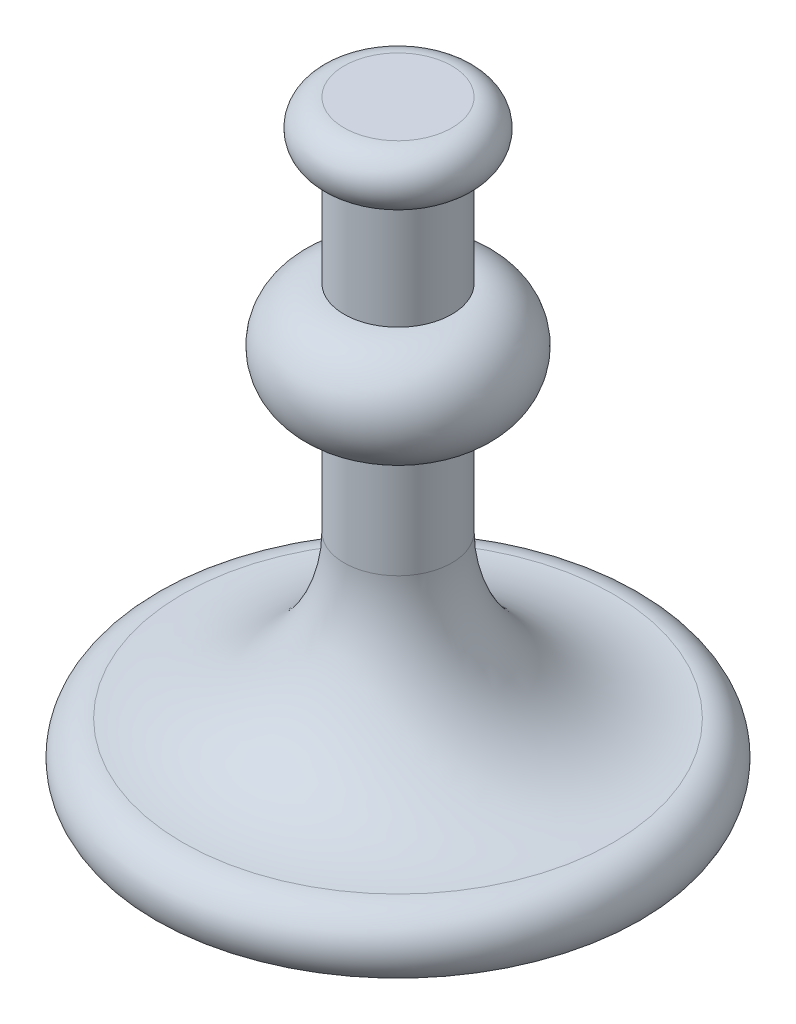
ISO-10303-21;
HEADER;
FILE_DESCRIPTION(('STEP AP214'),'2;1');
FILE_NAME('part.step','',(''),(''),'','','');
FILE_SCHEMA(('AUTOMOTIVE_DESIGN { 1 0 10303 214 1 1 1 1 }'));
ENDSEC;
DATA;
#1=APPLICATION_CONTEXT('core data for automotive mechanical design processes');
#2=APPLICATION_PROTOCOL_DEFINITION('international standard','automotive_design',2000,#1);
#3=PRODUCT_CONTEXT('',#1,'mechanical');
#4=PRODUCT('Part','Part','',(#3));
#5=PRODUCT_RELATED_PRODUCT_CATEGORY('part','',(#4));
#6=PRODUCT_DEFINITION_FORMATION('','',#4);
#7=PRODUCT_DEFINITION_CONTEXT('part definition',#1,'design');
#8=PRODUCT_DEFINITION('design','',#6,#7);
#9=PRODUCT_DEFINITION_SHAPE('','',#8);
#10=(LENGTH_UNIT() NAMED_UNIT(*) SI_UNIT(.MILLI.,.METRE.));
#11=(NAMED_UNIT(*) PLANE_ANGLE_UNIT() SI_UNIT($,.RADIAN.));
#12=(NAMED_UNIT(*) SI_UNIT($,.STERADIAN.) SOLID_ANGLE_UNIT());
#13=UNCERTAINTY_MEASURE_WITH_UNIT(LENGTH_MEASURE(1.E-05),#10,'distance_accuracy_value','');
#14=(GEOMETRIC_REPRESENTATION_CONTEXT(3) GLOBAL_UNCERTAINTY_ASSIGNED_CONTEXT((#13)) GLOBAL_UNIT_ASSIGNED_CONTEXT((#10,
#11,#12)) REPRESENTATION_CONTEXT('',''));
#15=CARTESIAN_POINT('',(0.,0.,0.));
#16=DIRECTION('',(0.,0.,1.));
#17=DIRECTION('',(1.,0.,0.));
#18=AXIS2_PLACEMENT_3D('',#15,#16,#17);
#19=CARTESIAN_POINT('',(0.,0.,0.));
#20=DIRECTION('',(0.,-1.,0.));
#21=DIRECTION('',(0.,0.,-1.));
#22=AXIS2_PLACEMENT_3D('',#19,#20,#21);
#23=PLANE('',#22);
#24=CARTESIAN_POINT('',(0.,0.,0.));
#25=DIRECTION('',(0.,-1.,0.));
#26=DIRECTION('',(0.,0.,-1.));
#27=AXIS2_PLACEMENT_3D('',#24,#25,#26);
#28=CIRCLE('',#27,90.);
#29=CARTESIAN_POINT('',(0.,0.,-90.));
#30=VERTEX_POINT('',#29);
#31=EDGE_CURVE('E56',#30,#30,#28,.T.);
#32=ORIENTED_EDGE('',*,*,#31,.T.);
#33=EDGE_LOOP('',(#32));
#34=FACE_BOUND('',#33,.T.);
#35=ADVANCED_FACE('F31',(#34),#23,.T.);
#36=CARTESIAN_POINT('',(0.,220.,0.));
#37=DIRECTION('',(0.,1.,0.));
#38=DIRECTION('',(0.,0.,1.));
#39=AXIS2_PLACEMENT_3D('',#36,#37,#38);
#40=PLANE('',#39);
#41=CARTESIAN_POINT('',(0.,220.,0.));
#42=DIRECTION('',(0.,-1.,0.));
#43=DIRECTION('',(0.,0.,-1.));
#44=AXIS2_PLACEMENT_3D('',#41,#42,#43);
#45=CIRCLE('',#44,20.);
#46=CARTESIAN_POINT('',(0.,220.,-20.));
#47=VERTEX_POINT('',#46);
#48=EDGE_CURVE('E10',#47,#47,#45,.T.);
#49=ORIENTED_EDGE('',*,*,#48,.F.);
#50=EDGE_LOOP('',(#49));
#51=FACE_BOUND('',#50,.T.);
#52=ADVANCED_FACE('F73',(#51),#40,.T.);
#53=CARTESIAN_POINT('',(0.,210.,0.));
#54=DIRECTION('',(0.,-1.,0.));
#55=DIRECTION('',(0.,0.,-1.));
#56=AXIS2_PLACEMENT_3D('',#53,#54,#55);
#57=TOROIDAL_SURFACE('',#56,20.,10.);
#58=ORIENTED_EDGE('',*,*,#48,.T.);
#59=EDGE_LOOP('',(#58));
#60=FACE_BOUND('',#59,.T.);
#61=CARTESIAN_POINT('',(0.,200.,0.));
#62=DIRECTION('',(0.,-1.,0.));
#63=DIRECTION('',(0.,0.,-1.));
#64=AXIS2_PLACEMENT_3D('',#61,#62,#63);
#65=CIRCLE('',#64,20.);
#66=CARTESIAN_POINT('',(0.,200.,-20.));
#67=VERTEX_POINT('',#66);
#68=EDGE_CURVE('E37',#67,#67,#65,.T.);
#69=ORIENTED_EDGE('',*,*,#68,.F.);
#70=EDGE_LOOP('',(#69));
#71=FACE_BOUND('',#70,.T.);
#72=ADVANCED_FACE('F77',(#60,#71),#57,.T.);
#73=CARTESIAN_POINT('',(0.,0.,0.));
#74=DIRECTION('',(0.,-1.,0.));
#75=DIRECTION('',(0.,0.,-1.));
#76=AXIS2_PLACEMENT_3D('',#73,#74,#75);
#77=CYLINDRICAL_SURFACE('',#76,20.);
#78=ORIENTED_EDGE('',*,*,#68,.T.);
#79=EDGE_LOOP('',(#78));
#80=FACE_BOUND('',#79,.T.);
#81=CARTESIAN_POINT('',(0.,160.,0.));
#82=DIRECTION('',(0.,-1.,0.));
#83=DIRECTION('',(0.,0.,-1.));
#84=AXIS2_PLACEMENT_3D('',#81,#82,#83);
#85=CIRCLE('',#84,20.);
#86=CARTESIAN_POINT('',(0.,160.,-20.));
#87=VERTEX_POINT('',#86);
#88=EDGE_CURVE('E41',#87,#87,#85,.T.);
#89=ORIENTED_EDGE('',*,*,#88,.F.);
#90=EDGE_LOOP('',(#89));
#91=FACE_BOUND('',#90,.T.);
#92=ADVANCED_FACE('F82',(#80,#91),#77,.T.);
#93=CARTESIAN_POINT('',(0.,140.,0.));
#94=DIRECTION('',(0.,-1.,0.));
#95=DIRECTION('',(0.,0.,-1.));
#96=AXIS2_PLACEMENT_3D('',#93,#94,#95);
#97=DEGENERATE_TOROIDAL_SURFACE('',#96,20.,20.,.T.);
#98=ORIENTED_EDGE('',*,*,#88,.T.);
#99=EDGE_LOOP('',(#98));
#100=FACE_BOUND('',#99,.T.);
#101=CARTESIAN_POINT('',(0.,120.,0.));
#102=DIRECTION('',(0.,-1.,0.));
#103=DIRECTION('',(0.,0.,-1.));
#104=AXIS2_PLACEMENT_3D('',#101,#102,#103);
#105=CIRCLE('',#104,20.);
#106=CARTESIAN_POINT('',(0.,120.,-20.));
#107=VERTEX_POINT('',#106);
#108=EDGE_CURVE('E45',#107,#107,#105,.T.);
#109=ORIENTED_EDGE('',*,*,#108,.F.);
#110=EDGE_LOOP('',(#109));
#111=FACE_BOUND('',#110,.T.);
#112=ADVANCED_FACE('F87',(#100,#111),#97,.T.);
#113=CARTESIAN_POINT('',(0.,0.,0.));
#114=DIRECTION('',(0.,-1.,0.));
#115=DIRECTION('',(0.,0.,-1.));
#116=AXIS2_PLACEMENT_3D('',#113,#114,#115);
#117=CYLINDRICAL_SURFACE('',#116,20.);
#118=ORIENTED_EDGE('',*,*,#108,.T.);
#119=EDGE_LOOP('',(#118));
#120=FACE_BOUND('',#119,.T.);
#121=CARTESIAN_POINT('',(0.,80.,0.));
#122=DIRECTION('',(0.,-1.,0.));
#123=DIRECTION('',(0.,0.,-1.));
#124=AXIS2_PLACEMENT_3D('',#121,#122,#123);
#125=CIRCLE('',#124,20.);
#126=CARTESIAN_POINT('',(0.,80.,-20.));
#127=VERTEX_POINT('',#126);
#128=EDGE_CURVE('E50',#127,#127,#125,.T.);
#129=ORIENTED_EDGE('',*,*,#128,.F.);
#130=EDGE_LOOP('',(#129));
#131=FACE_BOUND('',#130,.T.);
#132=ADVANCED_FACE('F69',(#120,#131),#117,.T.);
#133=CARTESIAN_POINT('',(0.,80.,0.));
#134=DIRECTION('',(0.,-1.,0.));
#135=DIRECTION('',(0.,0.,-1.));
#136=AXIS2_PLACEMENT_3D('',#133,#134,#135);
#137=TOROIDAL_SURFACE('',#136,80.,60.);
#138=ORIENTED_EDGE('',*,*,#128,.T.);
#139=EDGE_LOOP('',(#138));
#140=FACE_BOUND('',#139,.T.);
#141=CARTESIAN_POINT('',(0.,20.,0.));
#142=DIRECTION('',(0.,-1.,0.));
#143=DIRECTION('',(0.,0.,-1.));
#144=AXIS2_PLACEMENT_3D('',#141,#142,#143);
#145=CIRCLE('',#144,80.);
#146=CARTESIAN_POINT('',(0.,20.,-80.));
#147=VERTEX_POINT('',#146);
#148=EDGE_CURVE('E53',#147,#147,#145,.T.);
#149=ORIENTED_EDGE('',*,*,#148,.F.);
#150=EDGE_LOOP('',(#149));
#151=FACE_BOUND('',#150,.T.);
#152=ADVANCED_FACE('F63',(#140,#151),#137,.F.);
#153=CARTESIAN_POINT('',(0.,7.50000000000002,0.));
#154=DIRECTION('',(0.,-1.,0.));
#155=DIRECTION('',(0.,0.,-1.));
#156=AXIS2_PLACEMENT_3D('',#153,#154,#155);
#157=TOROIDAL_SURFACE('',#156,80.,12.5);
#158=ORIENTED_EDGE('',*,*,#148,.T.);
#159=EDGE_LOOP('',(#158));
#160=FACE_BOUND('',#159,.T.);
#161=ORIENTED_EDGE('',*,*,#31,.F.);
#162=EDGE_LOOP('',(#161));
#163=FACE_BOUND('',#162,.T.);
#164=ADVANCED_FACE('F61',(#160,#163),#157,.T.);
#165=CLOSED_SHELL('',(#35,#52,#72,#92,#112,#132,#152,#164));
#166=MANIFOLD_SOLID_BREP('B2',#165);
#167=ADVANCED_BREP_SHAPE_REPRESENTATION('',(#18,#166),#14);
#168=SHAPE_DEFINITION_REPRESENTATION(#9,#167);
ENDSEC;
END-ISO-10303-21;
